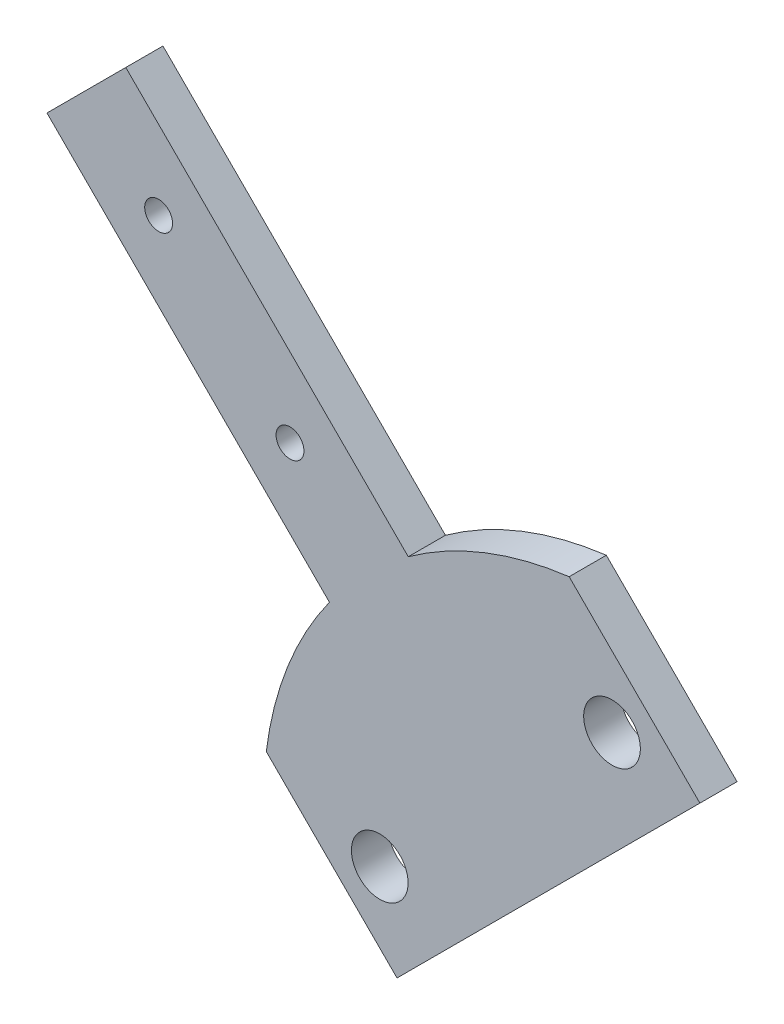
ISO-10303-21;
HEADER;
FILE_DESCRIPTION(('STEP AP214'),'2;1');
FILE_NAME('part.step','',(''),(''),'','','');
FILE_SCHEMA(('AUTOMOTIVE_DESIGN { 1 0 10303 214 1 1 1 1 }'));
ENDSEC;
DATA;
#1=APPLICATION_CONTEXT('core data for automotive mechanical design processes');
#2=APPLICATION_PROTOCOL_DEFINITION('international standard','automotive_design',2000,#1);
#3=PRODUCT_CONTEXT('',#1,'mechanical');
#4=PRODUCT('Part','Part','',(#3));
#5=PRODUCT_RELATED_PRODUCT_CATEGORY('part','',(#4));
#6=PRODUCT_DEFINITION_FORMATION('','',#4);
#7=PRODUCT_DEFINITION_CONTEXT('part definition',#1,'design');
#8=PRODUCT_DEFINITION('design','',#6,#7);
#9=PRODUCT_DEFINITION_SHAPE('','',#8);
#10=(LENGTH_UNIT() NAMED_UNIT(*) SI_UNIT(.MILLI.,.METRE.));
#11=(NAMED_UNIT(*) PLANE_ANGLE_UNIT() SI_UNIT($,.RADIAN.));
#12=(NAMED_UNIT(*) SI_UNIT($,.STERADIAN.) SOLID_ANGLE_UNIT());
#13=UNCERTAINTY_MEASURE_WITH_UNIT(LENGTH_MEASURE(1.E-05),#10,'distance_accuracy_value','');
#14=(GEOMETRIC_REPRESENTATION_CONTEXT(3) GLOBAL_UNCERTAINTY_ASSIGNED_CONTEXT((#13)) GLOBAL_UNIT_ASSIGNED_CONTEXT((#10,
#11,#12)) REPRESENTATION_CONTEXT('',''));
#15=CARTESIAN_POINT('',(0.,0.,0.));
#16=DIRECTION('',(0.,0.,1.));
#17=DIRECTION('',(1.,0.,0.));
#18=AXIS2_PLACEMENT_3D('',#15,#16,#17);
#19=CARTESIAN_POINT('',(0.,0.,4.));
#20=DIRECTION('',(0.,0.,-1.));
#21=DIRECTION('',(-1.,0.,0.));
#22=AXIS2_PLACEMENT_3D('',#19,#20,#21);
#23=PLANE('',#22);
#24=DIRECTION('',(0.707106781186548,-0.707106781186547,0.));
#25=VECTOR('',#24,1.);
#26=CARTESIAN_POINT('',(-23.1425738459143,-9.45628234489666,4.));
#27=LINE('',#26,#25);
#28=CARTESIAN_POINT('',(-37.2148206033817,4.61596441257073,4.));
#29=VERTEX_POINT('',#28);
#30=CARTESIAN_POINT('',(-23.1425738459143,-9.45628234489666,4.));
#31=VERTEX_POINT('',#30);
#32=EDGE_CURVE('E153',#29,#31,#27,.T.);
#33=ORIENTED_EDGE('',*,*,#32,.T.);
#34=DIRECTION('',(0.707106781186547,0.707106781186547,0.));
#35=VECTOR('',#34,1.);
#36=CARTESIAN_POINT('',(-23.1425738459143,-9.45628234489666,4.));
#37=LINE('',#36,#35);
#38=CARTESIAN_POINT('',(9.45628234489666,23.1425738459143,4.));
#39=VERTEX_POINT('',#38);
#40=EDGE_CURVE('E98',#31,#39,#37,.T.);
#41=ORIENTED_EDGE('',*,*,#40,.T.);
#42=DIRECTION('',(-0.707106781186551,0.707106781186544,0.));
#43=VECTOR('',#42,1.);
#44=CARTESIAN_POINT('',(9.45628234489666,23.1425738459143,4.));
#45=LINE('',#44,#43);
#46=CARTESIAN_POINT('',(-4.61596441257086,37.2148206033817,4.));
#47=VERTEX_POINT('',#46);
#48=EDGE_CURVE('E168',#39,#47,#45,.T.);
#49=ORIENTED_EDGE('',*,*,#48,.T.);
#50=CARTESIAN_POINT('',(0.,0.,4.));
#51=DIRECTION('',(0.,0.,1.));
#52=DIRECTION('',(1.,0.,0.));
#53=AXIS2_PLACEMENT_3D('',#50,#51,#52);
#54=CIRCLE('',#53,37.5);
#55=CARTESIAN_POINT('',(-21.9322518628034,30.417533237042,4.));
#56=VERTEX_POINT('',#55);
#57=EDGE_CURVE('E177',#47,#56,#54,.T.);
#58=ORIENTED_EDGE('',*,*,#57,.T.);
#59=DIRECTION('',(-0.707106781186547,0.707106781186548,0.));
#60=VECTOR('',#59,1.);
#61=CARTESIAN_POINT('',(-21.9322518628034,30.417533237042,4.));
#62=LINE('',#61,#60);
#63=CARTESIAN_POINT('',(-52.3378434538249,60.8231248280636,4.));
#64=VERTEX_POINT('',#63);
#65=EDGE_CURVE('E116',#56,#64,#62,.T.);
#66=ORIENTED_EDGE('',*,*,#65,.T.);
#67=DIRECTION('',(-0.707106781186547,-0.707106781186547,0.));
#68=VECTOR('',#67,1.);
#69=CARTESIAN_POINT('',(-60.8231248280635,52.337843453825,4.));
#70=LINE('',#69,#68);
#71=CARTESIAN_POINT('',(-60.8231248280635,52.337843453825,4.));
#72=VERTEX_POINT('',#71);
#73=EDGE_CURVE('E115',#64,#72,#70,.T.);
#74=ORIENTED_EDGE('',*,*,#73,.T.);
#75=DIRECTION('',(0.707106781186548,-0.707106781186547,0.));
#76=VECTOR('',#75,1.);
#77=CARTESIAN_POINT('',(-30.417533237042,21.9322518628034,4.));
#78=LINE('',#77,#76);
#79=CARTESIAN_POINT('',(-30.417533237042,21.9322518628034,4.));
#80=VERTEX_POINT('',#79);
#81=EDGE_CURVE('E118',#72,#80,#78,.T.);
#82=ORIENTED_EDGE('',*,*,#81,.T.);
#83=CARTESIAN_POINT('',(0.,0.,4.));
#84=DIRECTION('',(0.,0.,1.));
#85=DIRECTION('',(-1.,0.,0.));
#86=AXIS2_PLACEMENT_3D('',#83,#84,#85);
#87=CIRCLE('',#86,37.5);
#88=EDGE_CURVE('E57',#80,#29,#87,.T.);
#89=ORIENTED_EDGE('',*,*,#88,.T.);
#90=EDGE_LOOP('',(#33,#41,#49,#58,#66,#74,#82,#89));
#91=FACE_BOUND('',#90,.T.);
#92=CARTESIAN_POINT('',(0.,25.,4.));
#93=DIRECTION('',(0.,0.,1.));
#94=DIRECTION('',(1.,0.,0.));
#95=AXIS2_PLACEMENT_3D('',#92,#93,#94);
#96=CIRCLE('',#95,3.05);
#97=CARTESIAN_POINT('',(3.05,25.,4.));
#98=VERTEX_POINT('',#97);
#99=EDGE_CURVE('E139',#98,#98,#96,.T.);
#100=ORIENTED_EDGE('',*,*,#99,.F.);
#101=EDGE_LOOP('',(#100));
#102=FACE_BOUND('',#101,.T.);
#103=CARTESIAN_POINT('',(-25.,2.38295919631989E-12,4.));
#104=DIRECTION('',(0.,0.,1.));
#105=DIRECTION('',(1.,0.,0.));
#106=AXIS2_PLACEMENT_3D('',#103,#104,#105);
#107=CIRCLE('',#106,3.04999999999797);
#108=CARTESIAN_POINT('',(-21.950000000002,2.38295919631989E-12,4.));
#109=VERTEX_POINT('',#108);
#110=EDGE_CURVE('E187',#109,#109,#107,.T.);
#111=ORIENTED_EDGE('',*,*,#110,.F.);
#112=EDGE_LOOP('',(#111));
#113=FACE_BOUND('',#112,.T.);
#114=CARTESIAN_POINT('',(-48.8023095478922,48.8023095478922,4.));
#115=DIRECTION('',(0.,0.,1.));
#116=DIRECTION('',(1.,0.,0.));
#117=AXIS2_PLACEMENT_3D('',#114,#115,#116);
#118=CIRCLE('',#117,1.5);
#119=CARTESIAN_POINT('',(-47.3023095478922,48.8023095478922,4.));
#120=VERTEX_POINT('',#119);
#121=EDGE_CURVE('E191',#120,#120,#118,.T.);
#122=ORIENTED_EDGE('',*,*,#121,.F.);
#123=EDGE_LOOP('',(#122));
#124=FACE_BOUND('',#123,.T.);
#125=CARTESIAN_POINT('',(-34.6601739241613,34.6601739241613,4.));
#126=DIRECTION('',(0.,0.,1.));
#127=DIRECTION('',(1.,0.,0.));
#128=AXIS2_PLACEMENT_3D('',#125,#126,#127);
#129=CIRCLE('',#128,1.5);
#130=CARTESIAN_POINT('',(-33.1601739241613,34.6601739241613,4.));
#131=VERTEX_POINT('',#130);
#132=EDGE_CURVE('E197',#131,#131,#129,.T.);
#133=ORIENTED_EDGE('',*,*,#132,.F.);
#134=EDGE_LOOP('',(#133));
#135=FACE_BOUND('',#134,.T.);
#136=ADVANCED_FACE('F39',(#91,#102,#113,#124,#135),#23,.F.);
#137=CARTESIAN_POINT('',(0.,0.,0.));
#138=DIRECTION('',(0.,0.,-1.));
#139=DIRECTION('',(-1.,0.,0.));
#140=AXIS2_PLACEMENT_3D('',#137,#138,#139);
#141=PLANE('',#140);
#142=CARTESIAN_POINT('',(-48.8023095478922,48.8023095478922,0.));
#143=DIRECTION('',(0.,0.,1.));
#144=DIRECTION('',(1.,0.,0.));
#145=AXIS2_PLACEMENT_3D('',#142,#143,#144);
#146=CIRCLE('',#145,1.5);
#147=CARTESIAN_POINT('',(-47.3023095478922,48.8023095478922,0.));
#148=VERTEX_POINT('',#147);
#149=EDGE_CURVE('E200',#148,#148,#146,.T.);
#150=ORIENTED_EDGE('',*,*,#149,.T.);
#151=EDGE_LOOP('',(#150));
#152=FACE_BOUND('',#151,.T.);
#153=CARTESIAN_POINT('',(0.,25.,0.));
#154=DIRECTION('',(0.,0.,1.));
#155=DIRECTION('',(1.,0.,0.));
#156=AXIS2_PLACEMENT_3D('',#153,#154,#155);
#157=CIRCLE('',#156,3.05);
#158=CARTESIAN_POINT('',(3.05,25.,0.));
#159=VERTEX_POINT('',#158);
#160=EDGE_CURVE('E184',#159,#159,#157,.T.);
#161=ORIENTED_EDGE('',*,*,#160,.T.);
#162=EDGE_LOOP('',(#161));
#163=FACE_BOUND('',#162,.T.);
#164=DIRECTION('',(0.707106781186548,-0.707106781186547,0.));
#165=VECTOR('',#164,1.);
#166=CARTESIAN_POINT('',(-23.1425738459143,-9.45628234489666,0.));
#167=LINE('',#166,#165);
#168=CARTESIAN_POINT('',(-37.2148206033817,4.61596441257073,0.));
#169=VERTEX_POINT('',#168);
#170=CARTESIAN_POINT('',(-23.1425738459143,-9.45628234489666,0.));
#171=VERTEX_POINT('',#170);
#172=EDGE_CURVE('E136',#169,#171,#167,.T.);
#173=ORIENTED_EDGE('',*,*,#172,.F.);
#174=CARTESIAN_POINT('',(0.,0.,0.));
#175=DIRECTION('',(0.,0.,1.));
#176=DIRECTION('',(-1.,0.,0.));
#177=AXIS2_PLACEMENT_3D('',#174,#175,#176);
#178=CIRCLE('',#177,37.5);
#179=CARTESIAN_POINT('',(-30.417533237042,21.9322518628034,0.));
#180=VERTEX_POINT('',#179);
#181=EDGE_CURVE('E91',#180,#169,#178,.T.);
#182=ORIENTED_EDGE('',*,*,#181,.F.);
#183=DIRECTION('',(0.707106781186548,-0.707106781186547,0.));
#184=VECTOR('',#183,1.);
#185=CARTESIAN_POINT('',(-30.417533237042,21.9322518628034,0.));
#186=LINE('',#185,#184);
#187=CARTESIAN_POINT('',(-60.8231248280635,52.337843453825,0.));
#188=VERTEX_POINT('',#187);
#189=EDGE_CURVE('E82',#188,#180,#186,.T.);
#190=ORIENTED_EDGE('',*,*,#189,.F.);
#191=DIRECTION('',(-0.707106781186547,-0.707106781186547,0.));
#192=VECTOR('',#191,1.);
#193=CARTESIAN_POINT('',(-60.8231248280635,52.337843453825,0.));
#194=LINE('',#193,#192);
#195=CARTESIAN_POINT('',(-52.3378434538249,60.8231248280636,0.));
#196=VERTEX_POINT('',#195);
#197=EDGE_CURVE('E128',#196,#188,#194,.T.);
#198=ORIENTED_EDGE('',*,*,#197,.F.);
#199=DIRECTION('',(-0.707106781186547,0.707106781186548,0.));
#200=VECTOR('',#199,1.);
#201=CARTESIAN_POINT('',(-21.9322518628034,30.417533237042,0.));
#202=LINE('',#201,#200);
#203=CARTESIAN_POINT('',(-21.9322518628034,30.417533237042,0.));
#204=VERTEX_POINT('',#203);
#205=EDGE_CURVE('E147',#204,#196,#202,.T.);
#206=ORIENTED_EDGE('',*,*,#205,.F.);
#207=CARTESIAN_POINT('',(0.,0.,0.));
#208=DIRECTION('',(0.,0.,1.));
#209=DIRECTION('',(1.,0.,0.));
#210=AXIS2_PLACEMENT_3D('',#207,#208,#209);
#211=CIRCLE('',#210,37.5);
#212=CARTESIAN_POINT('',(-4.61596441257086,37.2148206033817,0.));
#213=VERTEX_POINT('',#212);
#214=EDGE_CURVE('E143',#213,#204,#211,.T.);
#215=ORIENTED_EDGE('',*,*,#214,.F.);
#216=DIRECTION('',(-0.707106781186551,0.707106781186544,0.));
#217=VECTOR('',#216,1.);
#218=CARTESIAN_POINT('',(9.45628234489666,23.1425738459143,0.));
#219=LINE('',#218,#217);
#220=CARTESIAN_POINT('',(9.45628234489666,23.1425738459143,0.));
#221=VERTEX_POINT('',#220);
#222=EDGE_CURVE('E145',#221,#213,#219,.T.);
#223=ORIENTED_EDGE('',*,*,#222,.F.);
#224=DIRECTION('',(0.707106781186547,0.707106781186547,0.));
#225=VECTOR('',#224,1.);
#226=CARTESIAN_POINT('',(-23.1425738459143,-9.45628234489666,0.));
#227=LINE('',#226,#225);
#228=EDGE_CURVE('E137',#171,#221,#227,.T.);
#229=ORIENTED_EDGE('',*,*,#228,.F.);
#230=EDGE_LOOP('',(#173,#182,#190,#198,#206,#215,#223,#229));
#231=FACE_BOUND('',#230,.T.);
#232=CARTESIAN_POINT('',(-25.,2.38295919631989E-12,0.));
#233=DIRECTION('',(0.,0.,1.));
#234=DIRECTION('',(1.,0.,0.));
#235=AXIS2_PLACEMENT_3D('',#232,#233,#234);
#236=CIRCLE('',#235,3.04999999999797);
#237=CARTESIAN_POINT('',(-21.950000000002,2.38295919631989E-12,0.));
#238=VERTEX_POINT('',#237);
#239=EDGE_CURVE('E192',#238,#238,#236,.T.);
#240=ORIENTED_EDGE('',*,*,#239,.T.);
#241=EDGE_LOOP('',(#240));
#242=FACE_BOUND('',#241,.T.);
#243=CARTESIAN_POINT('',(-34.6601739241613,34.6601739241613,0.));
#244=DIRECTION('',(0.,0.,1.));
#245=DIRECTION('',(1.,0.,0.));
#246=AXIS2_PLACEMENT_3D('',#243,#244,#245);
#247=CIRCLE('',#246,1.5);
#248=CARTESIAN_POINT('',(-33.1601739241613,34.6601739241613,0.));
#249=VERTEX_POINT('',#248);
#250=EDGE_CURVE('E201',#249,#249,#247,.T.);
#251=ORIENTED_EDGE('',*,*,#250,.T.);
#252=EDGE_LOOP('',(#251));
#253=FACE_BOUND('',#252,.T.);
#254=ADVANCED_FACE('F169',(#152,#163,#231,#242,#253),#141,.T.);
#255=CARTESIAN_POINT('',(-23.1425738459143,-9.45628234489666,4.));
#256=DIRECTION('',(0.707106781186547,0.707106781186548,0.));
#257=DIRECTION('',(-0.707106781186548,0.707106781186547,0.));
#258=AXIS2_PLACEMENT_3D('',#255,#256,#257);
#259=PLANE('',#258);
#260=ORIENTED_EDGE('',*,*,#172,.T.);
#261=DIRECTION('',(0.,0.,-1.));
#262=VECTOR('',#261,1.);
#263=CARTESIAN_POINT('',(-23.1425738459143,-9.45628234489666,4.));
#264=LINE('',#263,#262);
#265=EDGE_CURVE('E11',#31,#171,#264,.T.);
#266=ORIENTED_EDGE('',*,*,#265,.F.);
#267=ORIENTED_EDGE('',*,*,#32,.F.);
#268=DIRECTION('',(0.,0.,-1.));
#269=VECTOR('',#268,1.);
#270=CARTESIAN_POINT('',(-37.2148206033817,4.61596441257073,4.));
#271=LINE('',#270,#269);
#272=EDGE_CURVE('E135',#29,#169,#271,.T.);
#273=ORIENTED_EDGE('',*,*,#272,.T.);
#274=EDGE_LOOP('',(#260,#266,#267,#273));
#275=FACE_BOUND('',#274,.T.);
#276=ADVANCED_FACE('F41',(#275),#259,.F.);
#277=CARTESIAN_POINT('',(-23.1425738459143,-9.45628234489666,4.));
#278=DIRECTION('',(-0.707106781186547,0.707106781186547,0.));
#279=DIRECTION('',(-0.707106781186548,-0.707106781186548,0.));
#280=AXIS2_PLACEMENT_3D('',#277,#278,#279);
#281=PLANE('',#280);
#282=ORIENTED_EDGE('',*,*,#228,.T.);
#283=DIRECTION('',(0.,0.,-1.));
#284=VECTOR('',#283,1.);
#285=CARTESIAN_POINT('',(9.45628234489666,23.1425738459143,4.));
#286=LINE('',#285,#284);
#287=EDGE_CURVE('E48',#39,#221,#286,.T.);
#288=ORIENTED_EDGE('',*,*,#287,.F.);
#289=ORIENTED_EDGE('',*,*,#40,.F.);
#290=ORIENTED_EDGE('',*,*,#265,.T.);
#291=EDGE_LOOP('',(#282,#288,#289,#290));
#292=FACE_BOUND('',#291,.T.);
#293=ADVANCED_FACE('F234',(#292),#281,.F.);
#294=CARTESIAN_POINT('',(9.45628234489666,23.1425738459143,4.));
#295=DIRECTION('',(-0.707106781186544,-0.707106781186551,0.));
#296=DIRECTION('',(0.707106781186551,-0.707106781186544,0.));
#297=AXIS2_PLACEMENT_3D('',#294,#295,#296);
#298=PLANE('',#297);
#299=ORIENTED_EDGE('',*,*,#222,.T.);
#300=DIRECTION('',(0.,0.,-1.));
#301=VECTOR('',#300,1.);
#302=CARTESIAN_POINT('',(-4.61596441257086,37.2148206033817,4.));
#303=LINE('',#302,#301);
#304=EDGE_CURVE('E156',#47,#213,#303,.T.);
#305=ORIENTED_EDGE('',*,*,#304,.F.);
#306=ORIENTED_EDGE('',*,*,#48,.F.);
#307=ORIENTED_EDGE('',*,*,#287,.T.);
#308=EDGE_LOOP('',(#299,#305,#306,#307));
#309=FACE_BOUND('',#308,.T.);
#310=ADVANCED_FACE('F164',(#309),#298,.F.);
#311=CARTESIAN_POINT('',(0.,0.,4.));
#312=DIRECTION('',(0.,0.,-1.));
#313=DIRECTION('',(-1.,0.,0.));
#314=AXIS2_PLACEMENT_3D('',#311,#312,#313);
#315=CYLINDRICAL_SURFACE('',#314,37.5);
#316=ORIENTED_EDGE('',*,*,#214,.T.);
#317=DIRECTION('',(0.,0.,-1.));
#318=VECTOR('',#317,1.);
#319=CARTESIAN_POINT('',(-21.9322518628034,30.417533237042,4.));
#320=LINE('',#319,#318);
#321=EDGE_CURVE('E152',#56,#204,#320,.T.);
#322=ORIENTED_EDGE('',*,*,#321,.F.);
#323=ORIENTED_EDGE('',*,*,#57,.F.);
#324=ORIENTED_EDGE('',*,*,#304,.T.);
#325=EDGE_LOOP('',(#316,#322,#323,#324));
#326=FACE_BOUND('',#325,.T.);
#327=ADVANCED_FACE('F172',(#326),#315,.T.);
#328=CARTESIAN_POINT('',(-21.9322518628034,30.417533237042,4.));
#329=DIRECTION('',(-0.707106781186548,-0.707106781186547,0.));
#330=DIRECTION('',(0.707106781186547,-0.707106781186548,0.));
#331=AXIS2_PLACEMENT_3D('',#328,#329,#330);
#332=PLANE('',#331);
#333=ORIENTED_EDGE('',*,*,#205,.T.);
#334=DIRECTION('',(0.,0.,-1.));
#335=VECTOR('',#334,1.);
#336=CARTESIAN_POINT('',(-52.3378434538249,60.8231248280636,4.));
#337=LINE('',#336,#335);
#338=EDGE_CURVE('E130',#64,#196,#337,.T.);
#339=ORIENTED_EDGE('',*,*,#338,.F.);
#340=ORIENTED_EDGE('',*,*,#65,.F.);
#341=ORIENTED_EDGE('',*,*,#321,.T.);
#342=EDGE_LOOP('',(#333,#339,#340,#341));
#343=FACE_BOUND('',#342,.T.);
#344=ADVANCED_FACE('F178',(#343),#332,.F.);
#345=CARTESIAN_POINT('',(-60.8231248280635,52.337843453825,4.));
#346=DIRECTION('',(0.707106781186547,-0.707106781186547,0.));
#347=DIRECTION('',(0.707106781186548,0.707106781186548,0.));
#348=AXIS2_PLACEMENT_3D('',#345,#346,#347);
#349=PLANE('',#348);
#350=ORIENTED_EDGE('',*,*,#197,.T.);
#351=DIRECTION('',(0.,0.,-1.));
#352=VECTOR('',#351,1.);
#353=CARTESIAN_POINT('',(-60.8231248280635,52.337843453825,4.));
#354=LINE('',#353,#352);
#355=EDGE_CURVE('E121',#72,#188,#354,.T.);
#356=ORIENTED_EDGE('',*,*,#355,.F.);
#357=ORIENTED_EDGE('',*,*,#73,.F.);
#358=ORIENTED_EDGE('',*,*,#338,.T.);
#359=EDGE_LOOP('',(#350,#356,#357,#358));
#360=FACE_BOUND('',#359,.T.);
#361=ADVANCED_FACE('F125',(#360),#349,.F.);
#362=CARTESIAN_POINT('',(-30.417533237042,21.9322518628034,4.));
#363=DIRECTION('',(0.707106781186547,0.707106781186548,0.));
#364=DIRECTION('',(-0.707106781186548,0.707106781186547,0.));
#365=AXIS2_PLACEMENT_3D('',#362,#363,#364);
#366=PLANE('',#365);
#367=ORIENTED_EDGE('',*,*,#189,.T.);
#368=DIRECTION('',(0.,0.,-1.));
#369=VECTOR('',#368,1.);
#370=CARTESIAN_POINT('',(-30.417533237042,21.9322518628034,4.));
#371=LINE('',#370,#369);
#372=EDGE_CURVE('E126',#80,#180,#371,.T.);
#373=ORIENTED_EDGE('',*,*,#372,.F.);
#374=ORIENTED_EDGE('',*,*,#81,.F.);
#375=ORIENTED_EDGE('',*,*,#355,.T.);
#376=EDGE_LOOP('',(#367,#373,#374,#375));
#377=FACE_BOUND('',#376,.T.);
#378=ADVANCED_FACE('F127',(#377),#366,.F.);
#379=CARTESIAN_POINT('',(0.,0.,4.));
#380=DIRECTION('',(0.,0.,-1.));
#381=DIRECTION('',(-1.,0.,0.));
#382=AXIS2_PLACEMENT_3D('',#379,#380,#381);
#383=CYLINDRICAL_SURFACE('',#382,37.5);
#384=ORIENTED_EDGE('',*,*,#181,.T.);
#385=ORIENTED_EDGE('',*,*,#272,.F.);
#386=ORIENTED_EDGE('',*,*,#88,.F.);
#387=ORIENTED_EDGE('',*,*,#372,.T.);
#388=EDGE_LOOP('',(#384,#385,#386,#387));
#389=FACE_BOUND('',#388,.T.);
#390=ADVANCED_FACE('F223',(#389),#383,.T.);
#391=CARTESIAN_POINT('',(0.,25.,4.));
#392=DIRECTION('',(0.,0.,-1.));
#393=DIRECTION('',(-1.,0.,0.));
#394=AXIS2_PLACEMENT_3D('',#391,#392,#393);
#395=CYLINDRICAL_SURFACE('',#394,3.05);
#396=ORIENTED_EDGE('',*,*,#99,.T.);
#397=EDGE_LOOP('',(#396));
#398=FACE_BOUND('',#397,.T.);
#399=ORIENTED_EDGE('',*,*,#160,.F.);
#400=EDGE_LOOP('',(#399));
#401=FACE_BOUND('',#400,.T.);
#402=ADVANCED_FACE('F217',(#398,#401),#395,.F.);
#403=CARTESIAN_POINT('',(-25.,2.38295919631989E-12,4.));
#404=DIRECTION('',(0.,0.,-1.));
#405=DIRECTION('',(-1.,0.,0.));
#406=AXIS2_PLACEMENT_3D('',#403,#404,#405);
#407=CYLINDRICAL_SURFACE('',#406,3.04999999999797);
#408=ORIENTED_EDGE('',*,*,#110,.T.);
#409=EDGE_LOOP('',(#408));
#410=FACE_BOUND('',#409,.T.);
#411=ORIENTED_EDGE('',*,*,#239,.F.);
#412=EDGE_LOOP('',(#411));
#413=FACE_BOUND('',#412,.T.);
#414=ADVANCED_FACE('F296',(#410,#413),#407,.F.);
#415=CARTESIAN_POINT('',(-48.8023095478922,48.8023095478922,4.));
#416=DIRECTION('',(0.,0.,-1.));
#417=DIRECTION('',(-1.,0.,0.));
#418=AXIS2_PLACEMENT_3D('',#415,#416,#417);
#419=CYLINDRICAL_SURFACE('',#418,1.5);
#420=ORIENTED_EDGE('',*,*,#121,.T.);
#421=EDGE_LOOP('',(#420));
#422=FACE_BOUND('',#421,.T.);
#423=ORIENTED_EDGE('',*,*,#149,.F.);
#424=EDGE_LOOP('',(#423));
#425=FACE_BOUND('',#424,.T.);
#426=ADVANCED_FACE('F308',(#422,#425),#419,.F.);
#427=CARTESIAN_POINT('',(-34.6601739241613,34.6601739241613,4.));
#428=DIRECTION('',(0.,0.,-1.));
#429=DIRECTION('',(-1.,0.,0.));
#430=AXIS2_PLACEMENT_3D('',#427,#428,#429);
#431=CYLINDRICAL_SURFACE('',#430,1.5);
#432=ORIENTED_EDGE('',*,*,#132,.T.);
#433=EDGE_LOOP('',(#432));
#434=FACE_BOUND('',#433,.T.);
#435=ORIENTED_EDGE('',*,*,#250,.F.);
#436=EDGE_LOOP('',(#435));
#437=FACE_BOUND('',#436,.T.);
#438=ADVANCED_FACE('F209',(#434,#437),#431,.F.);
#439=CLOSED_SHELL('',(#136,#254,#276,#293,#310,#327,#344,#361,#378,#390,#402,#414,#426,#438));
#440=MANIFOLD_SOLID_BREP('B2',#439);
#441=ADVANCED_BREP_SHAPE_REPRESENTATION('',(#18,#440),#14);
#442=SHAPE_DEFINITION_REPRESENTATION(#9,#441);
ENDSEC;
END-ISO-10303-21;
